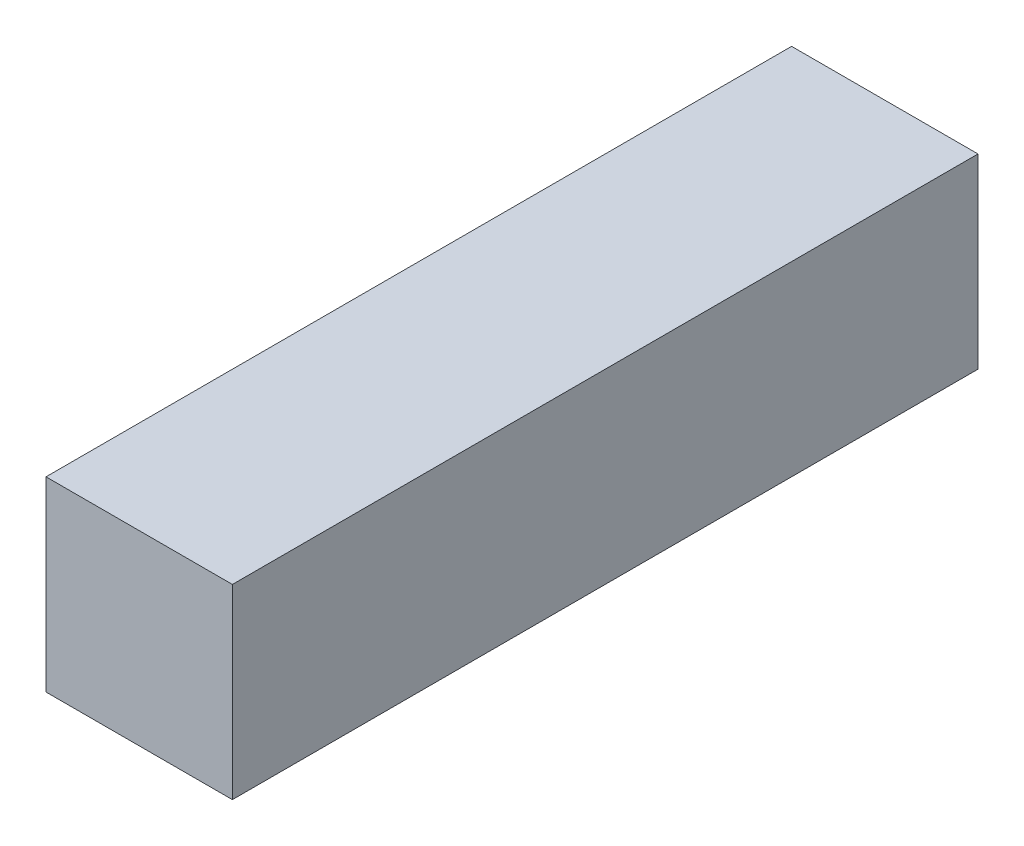
ISO-10303-21;
HEADER;
FILE_DESCRIPTION(('STEP AP214'),'2;1');
FILE_NAME('part.step','',(''),(''),'','','');
FILE_SCHEMA(('AUTOMOTIVE_DESIGN { 1 0 10303 214 1 1 1 1 }'));
ENDSEC;
DATA;
#1=APPLICATION_CONTEXT('core data for automotive mechanical design processes');
#2=APPLICATION_PROTOCOL_DEFINITION('international standard','automotive_design',2000,#1);
#3=PRODUCT_CONTEXT('',#1,'mechanical');
#4=PRODUCT('Part','Part','',(#3));
#5=PRODUCT_RELATED_PRODUCT_CATEGORY('part','',(#4));
#6=PRODUCT_DEFINITION_FORMATION('','',#4);
#7=PRODUCT_DEFINITION_CONTEXT('part definition',#1,'design');
#8=PRODUCT_DEFINITION('design','',#6,#7);
#9=PRODUCT_DEFINITION_SHAPE('','',#8);
#10=(LENGTH_UNIT() NAMED_UNIT(*) SI_UNIT(.MILLI.,.METRE.));
#11=(NAMED_UNIT(*) PLANE_ANGLE_UNIT() SI_UNIT($,.RADIAN.));
#12=(NAMED_UNIT(*) SI_UNIT($,.STERADIAN.) SOLID_ANGLE_UNIT());
#13=UNCERTAINTY_MEASURE_WITH_UNIT(LENGTH_MEASURE(1.E-05),#10,'distance_accuracy_value','');
#14=(GEOMETRIC_REPRESENTATION_CONTEXT(3) GLOBAL_UNCERTAINTY_ASSIGNED_CONTEXT((#13)) GLOBAL_UNIT_ASSIGNED_CONTEXT((#10,
#11,#12)) REPRESENTATION_CONTEXT('',''));
#15=CARTESIAN_POINT('',(0.,0.,0.));
#16=DIRECTION('',(0.,0.,1.));
#17=DIRECTION('',(1.,0.,0.));
#18=AXIS2_PLACEMENT_3D('',#15,#16,#17);
#19=CARTESIAN_POINT('',(0.,0.,20.));
#20=DIRECTION('',(1.,0.,0.));
#21=DIRECTION('',(0.,0.,-1.));
#22=AXIS2_PLACEMENT_3D('',#19,#20,#21);
#23=PLANE('',#22);
#24=DIRECTION('',(0.,-1.,0.));
#25=VECTOR('',#24,1.);
#26=CARTESIAN_POINT('',(0.,0.,0.));
#27=LINE('',#26,#25);
#28=CARTESIAN_POINT('',(0.,5.,0.));
#29=VERTEX_POINT('',#28);
#30=CARTESIAN_POINT('',(0.,0.,0.));
#31=VERTEX_POINT('',#30);
#32=EDGE_CURVE('E95',#29,#31,#27,.T.);
#33=ORIENTED_EDGE('',*,*,#32,.T.);
#34=DIRECTION('',(0.,0.,-1.));
#35=VECTOR('',#34,1.);
#36=CARTESIAN_POINT('',(0.,0.,20.));
#37=LINE('',#36,#35);
#38=CARTESIAN_POINT('',(0.,0.,20.));
#39=VERTEX_POINT('',#38);
#40=EDGE_CURVE('E11',#39,#31,#37,.T.);
#41=ORIENTED_EDGE('',*,*,#40,.F.);
#42=DIRECTION('',(0.,-1.,0.));
#43=VECTOR('',#42,1.);
#44=CARTESIAN_POINT('',(0.,0.,20.));
#45=LINE('',#44,#43);
#46=CARTESIAN_POINT('',(0.,5.,20.));
#47=VERTEX_POINT('',#46);
#48=EDGE_CURVE('E83',#47,#39,#45,.T.);
#49=ORIENTED_EDGE('',*,*,#48,.F.);
#50=DIRECTION('',(0.,0.,-1.));
#51=VECTOR('',#50,1.);
#52=CARTESIAN_POINT('',(0.,5.,20.));
#53=LINE('',#52,#51);
#54=EDGE_CURVE('E91',#47,#29,#53,.T.);
#55=ORIENTED_EDGE('',*,*,#54,.T.);
#56=EDGE_LOOP('',(#33,#41,#49,#55));
#57=FACE_BOUND('',#56,.T.);
#58=ADVANCED_FACE('F32',(#57),#23,.F.);
#59=CARTESIAN_POINT('',(0.,0.,20.));
#60=DIRECTION('',(0.,1.,0.));
#61=DIRECTION('',(0.,0.,1.));
#62=AXIS2_PLACEMENT_3D('',#59,#60,#61);
#63=PLANE('',#62);
#64=DIRECTION('',(1.,0.,0.));
#65=VECTOR('',#64,1.);
#66=CARTESIAN_POINT('',(0.,0.,0.));
#67=LINE('',#66,#65);
#68=CARTESIAN_POINT('',(5.,0.,0.));
#69=VERTEX_POINT('',#68);
#70=EDGE_CURVE('E87',#31,#69,#67,.T.);
#71=ORIENTED_EDGE('',*,*,#70,.T.);
#72=DIRECTION('',(0.,0.,-1.));
#73=VECTOR('',#72,1.);
#74=CARTESIAN_POINT('',(5.,0.,20.));
#75=LINE('',#74,#73);
#76=CARTESIAN_POINT('',(5.,0.,20.));
#77=VERTEX_POINT('',#76);
#78=EDGE_CURVE('E40',#77,#69,#75,.T.);
#79=ORIENTED_EDGE('',*,*,#78,.F.);
#80=DIRECTION('',(1.,0.,0.));
#81=VECTOR('',#80,1.);
#82=CARTESIAN_POINT('',(0.,0.,20.));
#83=LINE('',#82,#81);
#84=EDGE_CURVE('E78',#39,#77,#83,.T.);
#85=ORIENTED_EDGE('',*,*,#84,.F.);
#86=ORIENTED_EDGE('',*,*,#40,.T.);
#87=EDGE_LOOP('',(#71,#79,#85,#86));
#88=FACE_BOUND('',#87,.T.);
#89=ADVANCED_FACE('F86',(#88),#63,.F.);
#90=CARTESIAN_POINT('',(5.,0.,20.));
#91=DIRECTION('',(-1.,0.,0.));
#92=DIRECTION('',(0.,0.,1.));
#93=AXIS2_PLACEMENT_3D('',#90,#91,#92);
#94=PLANE('',#93);
#95=DIRECTION('',(0.,1.,0.));
#96=VECTOR('',#95,1.);
#97=CARTESIAN_POINT('',(5.,0.,0.));
#98=LINE('',#97,#96);
#99=CARTESIAN_POINT('',(5.,5.,0.));
#100=VERTEX_POINT('',#99);
#101=EDGE_CURVE('E65',#69,#100,#98,.T.);
#102=ORIENTED_EDGE('',*,*,#101,.T.);
#103=DIRECTION('',(0.,0.,-1.));
#104=VECTOR('',#103,1.);
#105=CARTESIAN_POINT('',(5.,5.,20.));
#106=LINE('',#105,#104);
#107=CARTESIAN_POINT('',(5.,5.,20.));
#108=VERTEX_POINT('',#107);
#109=EDGE_CURVE('E88',#108,#100,#106,.T.);
#110=ORIENTED_EDGE('',*,*,#109,.F.);
#111=DIRECTION('',(0.,1.,0.));
#112=VECTOR('',#111,1.);
#113=CARTESIAN_POINT('',(5.,0.,20.));
#114=LINE('',#113,#112);
#115=EDGE_CURVE('E81',#77,#108,#114,.T.);
#116=ORIENTED_EDGE('',*,*,#115,.F.);
#117=ORIENTED_EDGE('',*,*,#78,.T.);
#118=EDGE_LOOP('',(#102,#110,#116,#117));
#119=FACE_BOUND('',#118,.T.);
#120=ADVANCED_FACE('F89',(#119),#94,.F.);
#121=CARTESIAN_POINT('',(0.,5.,20.));
#122=DIRECTION('',(0.,-1.,0.));
#123=DIRECTION('',(0.,0.,-1.));
#124=AXIS2_PLACEMENT_3D('',#121,#122,#123);
#125=PLANE('',#124);
#126=DIRECTION('',(-1.,0.,0.));
#127=VECTOR('',#126,1.);
#128=CARTESIAN_POINT('',(0.,5.,0.));
#129=LINE('',#128,#127);
#130=EDGE_CURVE('E71',#100,#29,#129,.T.);
#131=ORIENTED_EDGE('',*,*,#130,.T.);
#132=ORIENTED_EDGE('',*,*,#54,.F.);
#133=DIRECTION('',(-1.,0.,0.));
#134=VECTOR('',#133,1.);
#135=CARTESIAN_POINT('',(0.,5.,20.));
#136=LINE('',#135,#134);
#137=EDGE_CURVE('E48',#108,#47,#136,.T.);
#138=ORIENTED_EDGE('',*,*,#137,.F.);
#139=ORIENTED_EDGE('',*,*,#109,.T.);
#140=EDGE_LOOP('',(#131,#132,#138,#139));
#141=FACE_BOUND('',#140,.T.);
#142=ADVANCED_FACE('F102',(#141),#125,.F.);
#143=CARTESIAN_POINT('',(0.,5.,20.));
#144=DIRECTION('',(0.,0.,-1.));
#145=DIRECTION('',(-1.,0.,0.));
#146=AXIS2_PLACEMENT_3D('',#143,#144,#145);
#147=PLANE('',#146);
#148=ORIENTED_EDGE('',*,*,#48,.T.);
#149=ORIENTED_EDGE('',*,*,#84,.T.);
#150=ORIENTED_EDGE('',*,*,#115,.T.);
#151=ORIENTED_EDGE('',*,*,#137,.T.);
#152=EDGE_LOOP('',(#148,#149,#150,#151));
#153=FACE_BOUND('',#152,.T.);
#154=ADVANCED_FACE('F79',(#153),#147,.F.);
#155=CARTESIAN_POINT('',(0.,5.,0.));
#156=DIRECTION('',(0.,0.,-1.));
#157=DIRECTION('',(-1.,0.,0.));
#158=AXIS2_PLACEMENT_3D('',#155,#156,#157);
#159=PLANE('',#158);
#160=ORIENTED_EDGE('',*,*,#32,.F.);
#161=ORIENTED_EDGE('',*,*,#130,.F.);
#162=ORIENTED_EDGE('',*,*,#101,.F.);
#163=ORIENTED_EDGE('',*,*,#70,.F.);
#164=EDGE_LOOP('',(#160,#161,#162,#163));
#165=FACE_BOUND('',#164,.T.);
#166=ADVANCED_FACE('F105',(#165),#159,.T.);
#167=CLOSED_SHELL('',(#58,#89,#120,#142,#154,#166));
#168=MANIFOLD_SOLID_BREP('B2',#167);
#169=ADVANCED_BREP_SHAPE_REPRESENTATION('',(#18,#168),#14);
#170=SHAPE_DEFINITION_REPRESENTATION(#9,#169);
ENDSEC;
END-ISO-10303-21;
